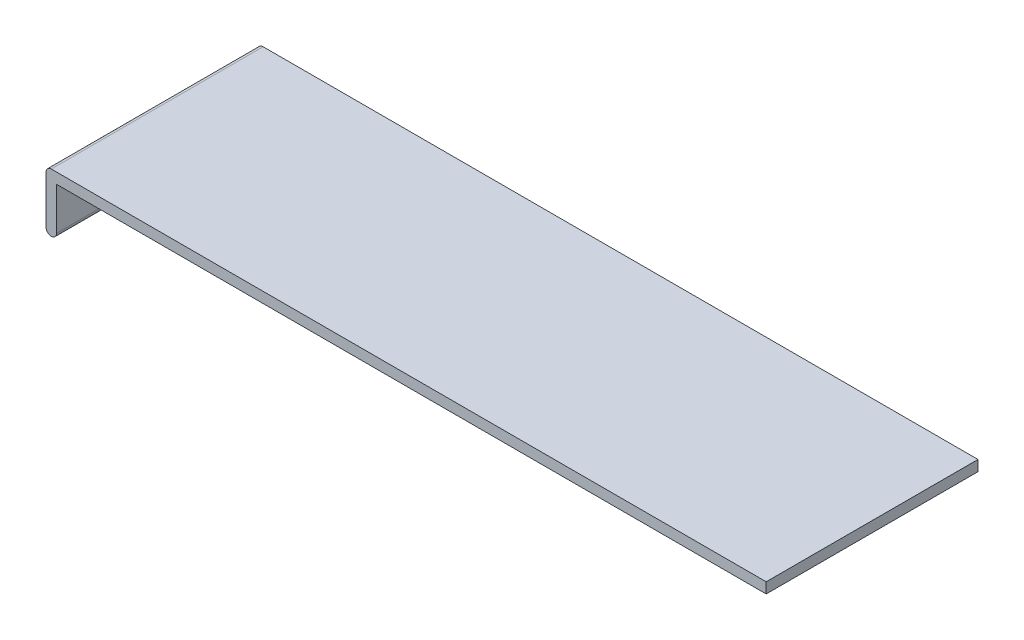
ISO-10303-21;
HEADER;
FILE_DESCRIPTION(('STEP AP214'),'2;1');
FILE_NAME('part.step','',(''),(''),'','','');
FILE_SCHEMA(('AUTOMOTIVE_DESIGN { 1 0 10303 214 1 1 1 1 }'));
ENDSEC;
DATA;
#1=APPLICATION_CONTEXT('core data for automotive mechanical design processes');
#2=APPLICATION_PROTOCOL_DEFINITION('international standard','automotive_design',2000,#1);
#3=PRODUCT_CONTEXT('',#1,'mechanical');
#4=PRODUCT('Part','Part','',(#3));
#5=PRODUCT_RELATED_PRODUCT_CATEGORY('part','',(#4));
#6=PRODUCT_DEFINITION_FORMATION('','',#4);
#7=PRODUCT_DEFINITION_CONTEXT('part definition',#1,'design');
#8=PRODUCT_DEFINITION('design','',#6,#7);
#9=PRODUCT_DEFINITION_SHAPE('','',#8);
#10=(LENGTH_UNIT() NAMED_UNIT(*) SI_UNIT(.MILLI.,.METRE.));
#11=(NAMED_UNIT(*) PLANE_ANGLE_UNIT() SI_UNIT($,.RADIAN.));
#12=(NAMED_UNIT(*) SI_UNIT($,.STERADIAN.) SOLID_ANGLE_UNIT());
#13=UNCERTAINTY_MEASURE_WITH_UNIT(LENGTH_MEASURE(1.E-05),#10,'distance_accuracy_value','');
#14=(GEOMETRIC_REPRESENTATION_CONTEXT(3) GLOBAL_UNCERTAINTY_ASSIGNED_CONTEXT((#13)) GLOBAL_UNIT_ASSIGNED_CONTEXT((#10,
#11,#12)) REPRESENTATION_CONTEXT('',''));
#15=CARTESIAN_POINT('',(0.,0.,0.));
#16=DIRECTION('',(0.,0.,1.));
#17=DIRECTION('',(1.,0.,0.));
#18=AXIS2_PLACEMENT_3D('',#15,#16,#17);
#19=CARTESIAN_POINT('',(0.,0.,4.));
#20=DIRECTION('',(0.,0.,-1.));
#21=DIRECTION('',(-1.,0.,0.));
#22=AXIS2_PLACEMENT_3D('',#19,#20,#21);
#23=CYLINDRICAL_SURFACE('',#22,0.1);
#24=CARTESIAN_POINT('',(0.,0.,0.));
#25=DIRECTION('',(0.,0.,1.));
#26=DIRECTION('',(1.,0.,0.));
#27=AXIS2_PLACEMENT_3D('',#24,#25,#26);
#28=CIRCLE('',#27,0.1);
#29=CARTESIAN_POINT('',(-0.1,0.,0.));
#30=VERTEX_POINT('',#29);
#31=CARTESIAN_POINT('',(0.1,0.,0.));
#32=VERTEX_POINT('',#31);
#33=EDGE_CURVE('E123',#30,#32,#28,.T.);
#34=ORIENTED_EDGE('',*,*,#33,.T.);
#35=DIRECTION('',(0.,0.,-1.));
#36=VECTOR('',#35,1.);
#37=CARTESIAN_POINT('',(0.1,0.,4.));
#38=LINE('',#37,#36);
#39=CARTESIAN_POINT('',(0.1,0.,4.));
#40=VERTEX_POINT('',#39);
#41=EDGE_CURVE('E11',#40,#32,#38,.T.);
#42=ORIENTED_EDGE('',*,*,#41,.F.);
#43=CARTESIAN_POINT('',(0.,0.,4.));
#44=DIRECTION('',(0.,0.,1.));
#45=DIRECTION('',(1.,0.,0.));
#46=AXIS2_PLACEMENT_3D('',#43,#44,#45);
#47=CIRCLE('',#46,0.1);
#48=CARTESIAN_POINT('',(-0.1,0.,4.));
#49=VERTEX_POINT('',#48);
#50=EDGE_CURVE('E136',#49,#40,#47,.T.);
#51=ORIENTED_EDGE('',*,*,#50,.F.);
#52=DIRECTION('',(0.,0.,-1.));
#53=VECTOR('',#52,1.);
#54=CARTESIAN_POINT('',(-0.1,0.,4.));
#55=LINE('',#54,#53);
#56=EDGE_CURVE('E119',#49,#30,#55,.T.);
#57=ORIENTED_EDGE('',*,*,#56,.T.);
#58=EDGE_LOOP('',(#34,#42,#51,#57));
#59=FACE_BOUND('',#58,.T.);
#60=ADVANCED_FACE('F32',(#59),#23,.T.);
#61=CARTESIAN_POINT('',(0.1,0.,4.));
#62=DIRECTION('',(-1.,0.,0.));
#63=DIRECTION('',(0.,0.,1.));
#64=AXIS2_PLACEMENT_3D('',#61,#62,#63);
#65=PLANE('',#64);
#66=DIRECTION('',(0.,1.,0.));
#67=VECTOR('',#66,1.);
#68=CARTESIAN_POINT('',(0.1,0.,0.));
#69=LINE('',#68,#67);
#70=CARTESIAN_POINT('',(0.1,0.8,0.));
#71=VERTEX_POINT('',#70);
#72=EDGE_CURVE('E126',#32,#71,#69,.T.);
#73=ORIENTED_EDGE('',*,*,#72,.T.);
#74=DIRECTION('',(0.,0.,-1.));
#75=VECTOR('',#74,1.);
#76=CARTESIAN_POINT('',(0.1,0.8,4.));
#77=LINE('',#76,#75);
#78=CARTESIAN_POINT('',(0.1,0.8,4.));
#79=VERTEX_POINT('',#78);
#80=EDGE_CURVE('E40',#79,#71,#77,.T.);
#81=ORIENTED_EDGE('',*,*,#80,.F.);
#82=DIRECTION('',(0.,1.,0.));
#83=VECTOR('',#82,1.);
#84=CARTESIAN_POINT('',(0.1,0.,4.));
#85=LINE('',#84,#83);
#86=EDGE_CURVE('E86',#40,#79,#85,.T.);
#87=ORIENTED_EDGE('',*,*,#86,.F.);
#88=ORIENTED_EDGE('',*,*,#41,.T.);
#89=EDGE_LOOP('',(#73,#81,#87,#88));
#90=FACE_BOUND('',#89,.T.);
#91=ADVANCED_FACE('F159',(#90),#65,.F.);
#92=CARTESIAN_POINT('',(0.1,0.8,4.));
#93=DIRECTION('',(0.,1.,0.));
#94=DIRECTION('',(-1.,0.,0.));
#95=AXIS2_PLACEMENT_3D('',#92,#93,#94);
#96=PLANE('',#95);
#97=DIRECTION('',(1.,0.,0.));
#98=VECTOR('',#97,1.);
#99=CARTESIAN_POINT('',(0.1,0.8,0.));
#100=LINE('',#99,#98);
#101=CARTESIAN_POINT('',(13.5,0.8,0.));
#102=VERTEX_POINT('',#101);
#103=EDGE_CURVE('E128',#71,#102,#100,.T.);
#104=ORIENTED_EDGE('',*,*,#103,.T.);
#105=DIRECTION('',(0.,0.,-1.));
#106=VECTOR('',#105,1.);
#107=CARTESIAN_POINT('',(13.5,0.8,4.));
#108=LINE('',#107,#106);
#109=CARTESIAN_POINT('',(13.5,0.8,4.));
#110=VERTEX_POINT('',#109);
#111=EDGE_CURVE('E140',#110,#102,#108,.T.);
#112=ORIENTED_EDGE('',*,*,#111,.F.);
#113=DIRECTION('',(1.,0.,0.));
#114=VECTOR('',#113,1.);
#115=CARTESIAN_POINT('',(0.1,0.8,4.));
#116=LINE('',#115,#114);
#117=EDGE_CURVE('E148',#79,#110,#116,.T.);
#118=ORIENTED_EDGE('',*,*,#117,.F.);
#119=ORIENTED_EDGE('',*,*,#80,.T.);
#120=EDGE_LOOP('',(#104,#112,#118,#119));
#121=FACE_BOUND('',#120,.T.);
#122=ADVANCED_FACE('F146',(#121),#96,.F.);
#123=CARTESIAN_POINT('',(13.5,1.,4.));
#124=DIRECTION('',(-1.,0.,0.));
#125=DIRECTION('',(0.,0.,1.));
#126=AXIS2_PLACEMENT_3D('',#123,#124,#125);
#127=PLANE('',#126);
#128=DIRECTION('',(0.,1.,0.));
#129=VECTOR('',#128,1.);
#130=CARTESIAN_POINT('',(13.5,1.,0.));
#131=LINE('',#130,#129);
#132=CARTESIAN_POINT('',(13.5,1.,0.));
#133=VERTEX_POINT('',#132);
#134=EDGE_CURVE('E130',#102,#133,#131,.T.);
#135=ORIENTED_EDGE('',*,*,#134,.T.);
#136=DIRECTION('',(0.,0.,-1.));
#137=VECTOR('',#136,1.);
#138=CARTESIAN_POINT('',(13.5,1.,4.));
#139=LINE('',#138,#137);
#140=CARTESIAN_POINT('',(13.5,1.,4.));
#141=VERTEX_POINT('',#140);
#142=EDGE_CURVE('E114',#141,#133,#139,.T.);
#143=ORIENTED_EDGE('',*,*,#142,.F.);
#144=DIRECTION('',(0.,1.,0.));
#145=VECTOR('',#144,1.);
#146=CARTESIAN_POINT('',(13.5,1.,4.));
#147=LINE('',#146,#145);
#148=EDGE_CURVE('E103',#110,#141,#147,.T.);
#149=ORIENTED_EDGE('',*,*,#148,.F.);
#150=ORIENTED_EDGE('',*,*,#111,.T.);
#151=EDGE_LOOP('',(#135,#143,#149,#150));
#152=FACE_BOUND('',#151,.T.);
#153=ADVANCED_FACE('F152',(#152),#127,.F.);
#154=CARTESIAN_POINT('',(0.,1.,4.));
#155=DIRECTION('',(0.,-1.,0.));
#156=DIRECTION('',(0.,0.,-1.));
#157=AXIS2_PLACEMENT_3D('',#154,#155,#156);
#158=PLANE('',#157);
#159=DIRECTION('',(-1.,0.,0.));
#160=VECTOR('',#159,1.);
#161=CARTESIAN_POINT('',(0.,1.,0.));
#162=LINE('',#161,#160);
#163=CARTESIAN_POINT('',(0.,1.,0.));
#164=VERTEX_POINT('',#163);
#165=EDGE_CURVE('E112',#133,#164,#162,.T.);
#166=ORIENTED_EDGE('',*,*,#165,.T.);
#167=DIRECTION('',(0.,0.,-1.));
#168=VECTOR('',#167,1.);
#169=CARTESIAN_POINT('',(0.,1.,4.));
#170=LINE('',#169,#168);
#171=CARTESIAN_POINT('',(0.,1.,4.));
#172=VERTEX_POINT('',#171);
#173=EDGE_CURVE('E109',#172,#164,#170,.T.);
#174=ORIENTED_EDGE('',*,*,#173,.F.);
#175=DIRECTION('',(-1.,0.,0.));
#176=VECTOR('',#175,1.);
#177=CARTESIAN_POINT('',(0.,1.,4.));
#178=LINE('',#177,#176);
#179=EDGE_CURVE('E96',#141,#172,#178,.T.);
#180=ORIENTED_EDGE('',*,*,#179,.F.);
#181=ORIENTED_EDGE('',*,*,#142,.T.);
#182=EDGE_LOOP('',(#166,#174,#180,#181));
#183=FACE_BOUND('',#182,.T.);
#184=ADVANCED_FACE('F110',(#183),#158,.F.);
#185=CARTESIAN_POINT('',(0.,0.9,4.));
#186=DIRECTION('',(0.,0.,-1.));
#187=DIRECTION('',(-1.,0.,0.));
#188=AXIS2_PLACEMENT_3D('',#185,#186,#187);
#189=CYLINDRICAL_SURFACE('',#188,0.1);
#190=CARTESIAN_POINT('',(0.,0.9,0.));
#191=DIRECTION('',(0.,0.,1.));
#192=DIRECTION('',(1.,0.,0.));
#193=AXIS2_PLACEMENT_3D('',#190,#191,#192);
#194=CIRCLE('',#193,0.1);
#195=CARTESIAN_POINT('',(-0.1,0.9,0.));
#196=VERTEX_POINT('',#195);
#197=EDGE_CURVE('E133',#164,#196,#194,.T.);
#198=ORIENTED_EDGE('',*,*,#197,.T.);
#199=DIRECTION('',(0.,0.,-1.));
#200=VECTOR('',#199,1.);
#201=CARTESIAN_POINT('',(-0.1,0.9,4.));
#202=LINE('',#201,#200);
#203=CARTESIAN_POINT('',(-0.1,0.9,4.));
#204=VERTEX_POINT('',#203);
#205=EDGE_CURVE('E115',#204,#196,#202,.T.);
#206=ORIENTED_EDGE('',*,*,#205,.F.);
#207=CARTESIAN_POINT('',(0.,0.9,4.));
#208=DIRECTION('',(0.,0.,1.));
#209=DIRECTION('',(1.,0.,0.));
#210=AXIS2_PLACEMENT_3D('',#207,#208,#209);
#211=CIRCLE('',#210,0.1);
#212=EDGE_CURVE('E100',#172,#204,#211,.T.);
#213=ORIENTED_EDGE('',*,*,#212,.F.);
#214=ORIENTED_EDGE('',*,*,#173,.T.);
#215=EDGE_LOOP('',(#198,#206,#213,#214));
#216=FACE_BOUND('',#215,.T.);
#217=ADVANCED_FACE('F117',(#216),#189,.T.);
#218=CARTESIAN_POINT('',(-0.1,0.,4.));
#219=DIRECTION('',(1.,0.,0.));
#220=DIRECTION('',(0.,0.,-1.));
#221=AXIS2_PLACEMENT_3D('',#218,#219,#220);
#222=PLANE('',#221);
#223=DIRECTION('',(0.,-1.,0.));
#224=VECTOR('',#223,1.);
#225=CARTESIAN_POINT('',(-0.1,0.,0.));
#226=LINE('',#225,#224);
#227=EDGE_CURVE('E74',#196,#30,#226,.T.);
#228=ORIENTED_EDGE('',*,*,#227,.T.);
#229=ORIENTED_EDGE('',*,*,#56,.F.);
#230=DIRECTION('',(0.,-1.,0.));
#231=VECTOR('',#230,1.);
#232=CARTESIAN_POINT('',(-0.1,0.8,4.));
#233=LINE('',#232,#231);
#234=EDGE_CURVE('E48',#204,#49,#233,.T.);
#235=ORIENTED_EDGE('',*,*,#234,.F.);
#236=ORIENTED_EDGE('',*,*,#205,.T.);
#237=EDGE_LOOP('',(#228,#229,#235,#236));
#238=FACE_BOUND('',#237,.T.);
#239=ADVANCED_FACE('F173',(#238),#222,.F.);
#240=CARTESIAN_POINT('',(0.,0.,4.));
#241=DIRECTION('',(0.,0.,1.));
#242=DIRECTION('',(1.,0.,0.));
#243=AXIS2_PLACEMENT_3D('',#240,#241,#242);
#244=PLANE('',#243);
#245=ORIENTED_EDGE('',*,*,#50,.T.);
#246=ORIENTED_EDGE('',*,*,#86,.T.);
#247=ORIENTED_EDGE('',*,*,#117,.T.);
#248=ORIENTED_EDGE('',*,*,#148,.T.);
#249=ORIENTED_EDGE('',*,*,#179,.T.);
#250=ORIENTED_EDGE('',*,*,#212,.T.);
#251=ORIENTED_EDGE('',*,*,#234,.T.);
#252=EDGE_LOOP('',(#245,#246,#247,#248,#249,#250,#251));
#253=FACE_BOUND('',#252,.T.);
#254=ADVANCED_FACE('F98',(#253),#244,.T.);
#255=CARTESIAN_POINT('',(0.,0.,0.));
#256=DIRECTION('',(0.,0.,1.));
#257=DIRECTION('',(1.,0.,0.));
#258=AXIS2_PLACEMENT_3D('',#255,#256,#257);
#259=PLANE('',#258);
#260=ORIENTED_EDGE('',*,*,#33,.F.);
#261=ORIENTED_EDGE('',*,*,#227,.F.);
#262=ORIENTED_EDGE('',*,*,#197,.F.);
#263=ORIENTED_EDGE('',*,*,#165,.F.);
#264=ORIENTED_EDGE('',*,*,#134,.F.);
#265=ORIENTED_EDGE('',*,*,#103,.F.);
#266=ORIENTED_EDGE('',*,*,#72,.F.);
#267=EDGE_LOOP('',(#260,#261,#262,#263,#264,#265,#266));
#268=FACE_BOUND('',#267,.T.);
#269=ADVANCED_FACE('F150',(#268),#259,.F.);
#270=CLOSED_SHELL('',(#60,#91,#122,#153,#184,#217,#239,#254,#269));
#271=MANIFOLD_SOLID_BREP('B2',#270);
#272=ADVANCED_BREP_SHAPE_REPRESENTATION('',(#18,#271),#14);
#273=SHAPE_DEFINITION_REPRESENTATION(#9,#272);
ENDSEC;
END-ISO-10303-21;
